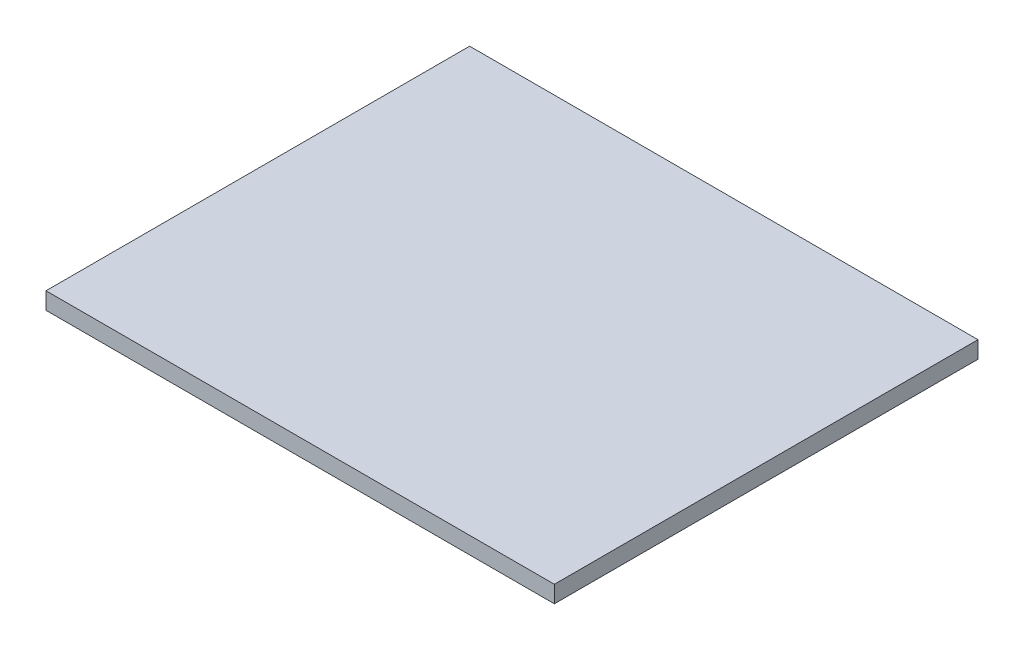
ISO-10303-21;
HEADER;
FILE_DESCRIPTION(('STEP AP214'),'2;1');
FILE_NAME('part.step','',(''),(''),'','','');
FILE_SCHEMA(('AUTOMOTIVE_DESIGN { 1 0 10303 214 1 1 1 1 }'));
ENDSEC;
DATA;
#1=APPLICATION_CONTEXT('core data for automotive mechanical design processes');
#2=APPLICATION_PROTOCOL_DEFINITION('international standard','automotive_design',2000,#1);
#3=PRODUCT_CONTEXT('',#1,'mechanical');
#4=PRODUCT('Part','Part','',(#3));
#5=PRODUCT_RELATED_PRODUCT_CATEGORY('part','',(#4));
#6=PRODUCT_DEFINITION_FORMATION('','',#4);
#7=PRODUCT_DEFINITION_CONTEXT('part definition',#1,'design');
#8=PRODUCT_DEFINITION('design','',#6,#7);
#9=PRODUCT_DEFINITION_SHAPE('','',#8);
#10=(LENGTH_UNIT() NAMED_UNIT(*) SI_UNIT(.MILLI.,.METRE.));
#11=(NAMED_UNIT(*) PLANE_ANGLE_UNIT() SI_UNIT($,.RADIAN.));
#12=(NAMED_UNIT(*) SI_UNIT($,.STERADIAN.) SOLID_ANGLE_UNIT());
#13=UNCERTAINTY_MEASURE_WITH_UNIT(LENGTH_MEASURE(1.E-05),#10,'distance_accuracy_value','');
#14=(GEOMETRIC_REPRESENTATION_CONTEXT(3) GLOBAL_UNCERTAINTY_ASSIGNED_CONTEXT((#13)) GLOBAL_UNIT_ASSIGNED_CONTEXT((#10,
#11,#12)) REPRESENTATION_CONTEXT('',''));
#15=CARTESIAN_POINT('',(0.,0.,0.));
#16=DIRECTION('',(0.,0.,1.));
#17=DIRECTION('',(1.,0.,0.));
#18=AXIS2_PLACEMENT_3D('',#15,#16,#17);
#19=CARTESIAN_POINT('',(600.,-40.,500.));
#20=DIRECTION('',(1.,0.,0.));
#21=DIRECTION('',(0.,0.,-1.));
#22=AXIS2_PLACEMENT_3D('',#19,#20,#21);
#23=PLANE('',#22);
#24=DIRECTION('',(0.,0.,-1.));
#25=VECTOR('',#24,1.);
#26=CARTESIAN_POINT('',(600.,0.,500.));
#27=LINE('',#26,#25);
#28=CARTESIAN_POINT('',(600.,0.,500.));
#29=VERTEX_POINT('',#28);
#30=CARTESIAN_POINT('',(600.,0.,-500.));
#31=VERTEX_POINT('',#30);
#32=EDGE_CURVE('E132',#29,#31,#27,.T.);
#33=ORIENTED_EDGE('',*,*,#32,.F.);
#34=DIRECTION('',(0.,1.,0.));
#35=VECTOR('',#34,1.);
#36=CARTESIAN_POINT('',(600.,-40.,500.));
#37=LINE('',#36,#35);
#38=CARTESIAN_POINT('',(600.,-40.,500.));
#39=VERTEX_POINT('',#38);
#40=EDGE_CURVE('E11',#39,#29,#37,.T.);
#41=ORIENTED_EDGE('',*,*,#40,.F.);
#42=DIRECTION('',(0.,0.,-1.));
#43=VECTOR('',#42,1.);
#44=CARTESIAN_POINT('',(600.,-40.,500.));
#45=LINE('',#44,#43);
#46=CARTESIAN_POINT('',(600.,-40.,-500.));
#47=VERTEX_POINT('',#46);
#48=EDGE_CURVE('E143',#39,#47,#45,.T.);
#49=ORIENTED_EDGE('',*,*,#48,.T.);
#50=DIRECTION('',(0.,1.,0.));
#51=VECTOR('',#50,1.);
#52=CARTESIAN_POINT('',(600.,-40.,-500.));
#53=LINE('',#52,#51);
#54=EDGE_CURVE('E46',#47,#31,#53,.T.);
#55=ORIENTED_EDGE('',*,*,#54,.T.);
#56=EDGE_LOOP('',(#33,#41,#49,#55));
#57=FACE_BOUND('',#56,.T.);
#58=ADVANCED_FACE('F43',(#57),#23,.T.);
#59=CARTESIAN_POINT('',(-600.,-40.,500.));
#60=DIRECTION('',(0.,0.,1.));
#61=DIRECTION('',(1.,0.,0.));
#62=AXIS2_PLACEMENT_3D('',#59,#60,#61);
#63=PLANE('',#62);
#64=DIRECTION('',(1.,0.,0.));
#65=VECTOR('',#64,1.);
#66=CARTESIAN_POINT('',(-600.,0.,500.));
#67=LINE('',#66,#65);
#68=CARTESIAN_POINT('',(-600.,0.,500.));
#69=VERTEX_POINT('',#68);
#70=EDGE_CURVE('E148',#69,#29,#67,.T.);
#71=ORIENTED_EDGE('',*,*,#70,.F.);
#72=DIRECTION('',(0.,1.,0.));
#73=VECTOR('',#72,1.);
#74=CARTESIAN_POINT('',(-600.,-40.,500.));
#75=LINE('',#74,#73);
#76=CARTESIAN_POINT('',(-600.,-40.,500.));
#77=VERTEX_POINT('',#76);
#78=EDGE_CURVE('E52',#77,#69,#75,.T.);
#79=ORIENTED_EDGE('',*,*,#78,.F.);
#80=DIRECTION('',(1.,0.,0.));
#81=VECTOR('',#80,1.);
#82=CARTESIAN_POINT('',(-600.,-40.,500.));
#83=LINE('',#82,#81);
#84=EDGE_CURVE('E156',#77,#39,#83,.T.);
#85=ORIENTED_EDGE('',*,*,#84,.T.);
#86=ORIENTED_EDGE('',*,*,#40,.T.);
#87=EDGE_LOOP('',(#71,#79,#85,#86));
#88=FACE_BOUND('',#87,.T.);
#89=ADVANCED_FACE('F186',(#88),#63,.T.);
#90=CARTESIAN_POINT('',(-600.,-40.,500.));
#91=DIRECTION('',(-1.,0.,0.));
#92=DIRECTION('',(0.,0.,1.));
#93=AXIS2_PLACEMENT_3D('',#90,#91,#92);
#94=PLANE('',#93);
#95=DIRECTION('',(0.,0.,1.));
#96=VECTOR('',#95,1.);
#97=CARTESIAN_POINT('',(-600.,0.,500.));
#98=LINE('',#97,#96);
#99=CARTESIAN_POINT('',(-600.,0.,-500.));
#100=VERTEX_POINT('',#99);
#101=EDGE_CURVE('E163',#100,#69,#98,.T.);
#102=ORIENTED_EDGE('',*,*,#101,.F.);
#103=DIRECTION('',(0.,1.,0.));
#104=VECTOR('',#103,1.);
#105=CARTESIAN_POINT('',(-600.,-40.,-500.));
#106=LINE('',#105,#104);
#107=CARTESIAN_POINT('',(-600.,-40.,-500.));
#108=VERTEX_POINT('',#107);
#109=EDGE_CURVE('E171',#108,#100,#106,.T.);
#110=ORIENTED_EDGE('',*,*,#109,.F.);
#111=DIRECTION('',(0.,0.,1.));
#112=VECTOR('',#111,1.);
#113=CARTESIAN_POINT('',(-600.,-40.,500.));
#114=LINE('',#113,#112);
#115=EDGE_CURVE('E152',#108,#77,#114,.T.);
#116=ORIENTED_EDGE('',*,*,#115,.T.);
#117=ORIENTED_EDGE('',*,*,#78,.T.);
#118=EDGE_LOOP('',(#102,#110,#116,#117));
#119=FACE_BOUND('',#118,.T.);
#120=ADVANCED_FACE('F192',(#119),#94,.T.);
#121=CARTESIAN_POINT('',(-600.,-40.,-500.));
#122=DIRECTION('',(0.,0.,-1.));
#123=DIRECTION('',(-1.,0.,0.));
#124=AXIS2_PLACEMENT_3D('',#121,#122,#123);
#125=PLANE('',#124);
#126=DIRECTION('',(-1.,0.,0.));
#127=VECTOR('',#126,1.);
#128=CARTESIAN_POINT('',(-600.,0.,-500.));
#129=LINE('',#128,#127);
#130=EDGE_CURVE('E137',#31,#100,#129,.T.);
#131=ORIENTED_EDGE('',*,*,#130,.F.);
#132=ORIENTED_EDGE('',*,*,#54,.F.);
#133=DIRECTION('',(-1.,0.,0.));
#134=VECTOR('',#133,1.);
#135=CARTESIAN_POINT('',(-600.,-40.,-500.));
#136=LINE('',#135,#134);
#137=EDGE_CURVE('E147',#47,#108,#136,.T.);
#138=ORIENTED_EDGE('',*,*,#137,.T.);
#139=ORIENTED_EDGE('',*,*,#109,.T.);
#140=EDGE_LOOP('',(#131,#132,#138,#139));
#141=FACE_BOUND('',#140,.T.);
#142=ADVANCED_FACE('F181',(#141),#125,.T.);
#143=CARTESIAN_POINT('',(0.,-40.,0.));
#144=DIRECTION('',(0.,-1.,0.));
#145=DIRECTION('',(0.,0.,-1.));
#146=AXIS2_PLACEMENT_3D('',#143,#144,#145);
#147=PLANE('',#146);
#148=DIRECTION('',(0.,0.,1.));
#149=VECTOR('',#148,1.);
#150=CARTESIAN_POINT('',(125.,-40.,-125.));
#151=LINE('',#150,#149);
#152=CARTESIAN_POINT('',(125.,-40.,-125.));
#153=VERTEX_POINT('',#152);
#154=CARTESIAN_POINT('',(125.,-40.,125.));
#155=VERTEX_POINT('',#154);
#156=EDGE_CURVE('E60',#153,#155,#151,.T.);
#157=ORIENTED_EDGE('',*,*,#156,.F.);
#158=DIRECTION('',(1.,0.,0.));
#159=VECTOR('',#158,1.);
#160=CARTESIAN_POINT('',(-125.,-40.,-125.));
#161=LINE('',#160,#159);
#162=CARTESIAN_POINT('',(-125.,-40.,-125.));
#163=VERTEX_POINT('',#162);
#164=EDGE_CURVE('E64',#163,#153,#161,.T.);
#165=ORIENTED_EDGE('',*,*,#164,.F.);
#166=DIRECTION('',(0.,0.,-1.));
#167=VECTOR('',#166,1.);
#168=CARTESIAN_POINT('',(-125.,-40.,-125.));
#169=LINE('',#168,#167);
#170=CARTESIAN_POINT('',(-125.,-40.,125.));
#171=VERTEX_POINT('',#170);
#172=EDGE_CURVE('E309',#171,#163,#169,.T.);
#173=ORIENTED_EDGE('',*,*,#172,.F.);
#174=DIRECTION('',(-1.,0.,0.));
#175=VECTOR('',#174,1.);
#176=CARTESIAN_POINT('',(-125.,-40.,125.));
#177=LINE('',#176,#175);
#178=EDGE_CURVE('E319',#155,#171,#177,.T.);
#179=ORIENTED_EDGE('',*,*,#178,.F.);
#180=EDGE_LOOP('',(#157,#165,#173,#179));
#181=FACE_BOUND('',#180,.T.);
#182=ORIENTED_EDGE('',*,*,#48,.F.);
#183=ORIENTED_EDGE('',*,*,#84,.F.);
#184=ORIENTED_EDGE('',*,*,#115,.F.);
#185=ORIENTED_EDGE('',*,*,#137,.F.);
#186=EDGE_LOOP('',(#182,#183,#184,#185));
#187=FACE_BOUND('',#186,.T.);
#188=ADVANCED_FACE('F189',(#181,#187),#147,.T.);
#189=CARTESIAN_POINT('',(0.,0.,0.));
#190=DIRECTION('',(0.,-1.,0.));
#191=DIRECTION('',(0.,0.,-1.));
#192=AXIS2_PLACEMENT_3D('',#189,#190,#191);
#193=PLANE('',#192);
#194=ORIENTED_EDGE('',*,*,#32,.T.);
#195=ORIENTED_EDGE('',*,*,#130,.T.);
#196=ORIENTED_EDGE('',*,*,#101,.T.);
#197=ORIENTED_EDGE('',*,*,#70,.T.);
#198=EDGE_LOOP('',(#194,#195,#196,#197));
#199=FACE_BOUND('',#198,.T.);
#200=ADVANCED_FACE('F183',(#199),#193,.F.);
#201=CARTESIAN_POINT('',(125.,-140.,-125.));
#202=DIRECTION('',(-1.,0.,0.));
#203=DIRECTION('',(0.,0.,1.));
#204=AXIS2_PLACEMENT_3D('',#201,#202,#203);
#205=PLANE('',#204);
#206=ORIENTED_EDGE('',*,*,#156,.T.);
#207=DIRECTION('',(0.,1.,0.));
#208=VECTOR('',#207,1.);
#209=CARTESIAN_POINT('',(125.,-140.,125.));
#210=LINE('',#209,#208);
#211=CARTESIAN_POINT('',(125.,-140.,125.));
#212=VERTEX_POINT('',#211);
#213=EDGE_CURVE('E112',#212,#155,#210,.T.);
#214=ORIENTED_EDGE('',*,*,#213,.F.);
#215=DIRECTION('',(0.,0.,1.));
#216=VECTOR('',#215,1.);
#217=CARTESIAN_POINT('',(125.,-140.,-125.));
#218=LINE('',#217,#216);
#219=CARTESIAN_POINT('',(125.,-140.,-125.));
#220=VERTEX_POINT('',#219);
#221=EDGE_CURVE('E119',#220,#212,#218,.T.);
#222=ORIENTED_EDGE('',*,*,#221,.F.);
#223=DIRECTION('',(0.,1.,0.));
#224=VECTOR('',#223,1.);
#225=CARTESIAN_POINT('',(125.,-140.,-125.));
#226=LINE('',#225,#224);
#227=EDGE_CURVE('E306',#220,#153,#226,.T.);
#228=ORIENTED_EDGE('',*,*,#227,.T.);
#229=EDGE_LOOP('',(#206,#214,#222,#228));
#230=FACE_BOUND('',#229,.T.);
#231=ADVANCED_FACE('F130',(#230),#205,.F.);
#232=CARTESIAN_POINT('',(-125.,-140.,125.));
#233=DIRECTION('',(0.,0.,-1.));
#234=DIRECTION('',(-1.,0.,0.));
#235=AXIS2_PLACEMENT_3D('',#232,#233,#234);
#236=PLANE('',#235);
#237=ORIENTED_EDGE('',*,*,#178,.T.);
#238=DIRECTION('',(0.,1.,0.));
#239=VECTOR('',#238,1.);
#240=CARTESIAN_POINT('',(-125.,-140.,125.));
#241=LINE('',#240,#239);
#242=CARTESIAN_POINT('',(-125.,-140.,125.));
#243=VERTEX_POINT('',#242);
#244=EDGE_CURVE('E114',#243,#171,#241,.T.);
#245=ORIENTED_EDGE('',*,*,#244,.F.);
#246=DIRECTION('',(-1.,0.,0.));
#247=VECTOR('',#246,1.);
#248=CARTESIAN_POINT('',(-125.,-140.,125.));
#249=LINE('',#248,#247);
#250=EDGE_CURVE('E107',#212,#243,#249,.T.);
#251=ORIENTED_EDGE('',*,*,#250,.F.);
#252=ORIENTED_EDGE('',*,*,#213,.T.);
#253=EDGE_LOOP('',(#237,#245,#251,#252));
#254=FACE_BOUND('',#253,.T.);
#255=ADVANCED_FACE('F110',(#254),#236,.F.);
#256=CARTESIAN_POINT('',(-125.,-140.,-125.));
#257=DIRECTION('',(1.,0.,0.));
#258=DIRECTION('',(0.,0.,-1.));
#259=AXIS2_PLACEMENT_3D('',#256,#257,#258);
#260=PLANE('',#259);
#261=ORIENTED_EDGE('',*,*,#172,.T.);
#262=DIRECTION('',(0.,1.,0.));
#263=VECTOR('',#262,1.);
#264=CARTESIAN_POINT('',(-125.,-140.,-125.));
#265=LINE('',#264,#263);
#266=CARTESIAN_POINT('',(-125.,-140.,-125.));
#267=VERTEX_POINT('',#266);
#268=EDGE_CURVE('E139',#267,#163,#265,.T.);
#269=ORIENTED_EDGE('',*,*,#268,.F.);
#270=DIRECTION('',(0.,0.,-1.));
#271=VECTOR('',#270,1.);
#272=CARTESIAN_POINT('',(-125.,-140.,-125.));
#273=LINE('',#272,#271);
#274=EDGE_CURVE('E118',#243,#267,#273,.T.);
#275=ORIENTED_EDGE('',*,*,#274,.F.);
#276=ORIENTED_EDGE('',*,*,#244,.T.);
#277=EDGE_LOOP('',(#261,#269,#275,#276));
#278=FACE_BOUND('',#277,.T.);
#279=ADVANCED_FACE('F256',(#278),#260,.F.);
#280=CARTESIAN_POINT('',(-125.,-140.,-125.));
#281=DIRECTION('',(0.,0.,1.));
#282=DIRECTION('',(1.,0.,0.));
#283=AXIS2_PLACEMENT_3D('',#280,#281,#282);
#284=PLANE('',#283);
#285=ORIENTED_EDGE('',*,*,#164,.T.);
#286=ORIENTED_EDGE('',*,*,#227,.F.);
#287=DIRECTION('',(1.,0.,0.));
#288=VECTOR('',#287,1.);
#289=CARTESIAN_POINT('',(-125.,-140.,-125.));
#290=LINE('',#289,#288);
#291=EDGE_CURVE('E124',#267,#220,#290,.T.);
#292=ORIENTED_EDGE('',*,*,#291,.F.);
#293=ORIENTED_EDGE('',*,*,#268,.T.);
#294=EDGE_LOOP('',(#285,#286,#292,#293));
#295=FACE_BOUND('',#294,.T.);
#296=ADVANCED_FACE('F266',(#295),#284,.F.);
#297=CARTESIAN_POINT('',(0.,-140.,0.));
#298=DIRECTION('',(0.,1.,0.));
#299=DIRECTION('',(0.,0.,1.));
#300=AXIS2_PLACEMENT_3D('',#297,#298,#299);
#301=PLANE('',#300);
#302=ORIENTED_EDGE('',*,*,#221,.T.);
#303=ORIENTED_EDGE('',*,*,#250,.T.);
#304=ORIENTED_EDGE('',*,*,#274,.T.);
#305=ORIENTED_EDGE('',*,*,#291,.T.);
#306=EDGE_LOOP('',(#302,#303,#304,#305));
#307=FACE_BOUND('',#306,.T.);
#308=ADVANCED_FACE('F122',(#307),#301,.F.);
#309=CLOSED_SHELL('',(#58,#89,#120,#142,#188,#200,#231,#255,#279,#296,#308));
#310=MANIFOLD_SOLID_BREP('B2',#309);
#311=ADVANCED_BREP_SHAPE_REPRESENTATION('',(#18,#310),#14);
#312=SHAPE_DEFINITION_REPRESENTATION(#9,#311);
ENDSEC;
END-ISO-10303-21;
